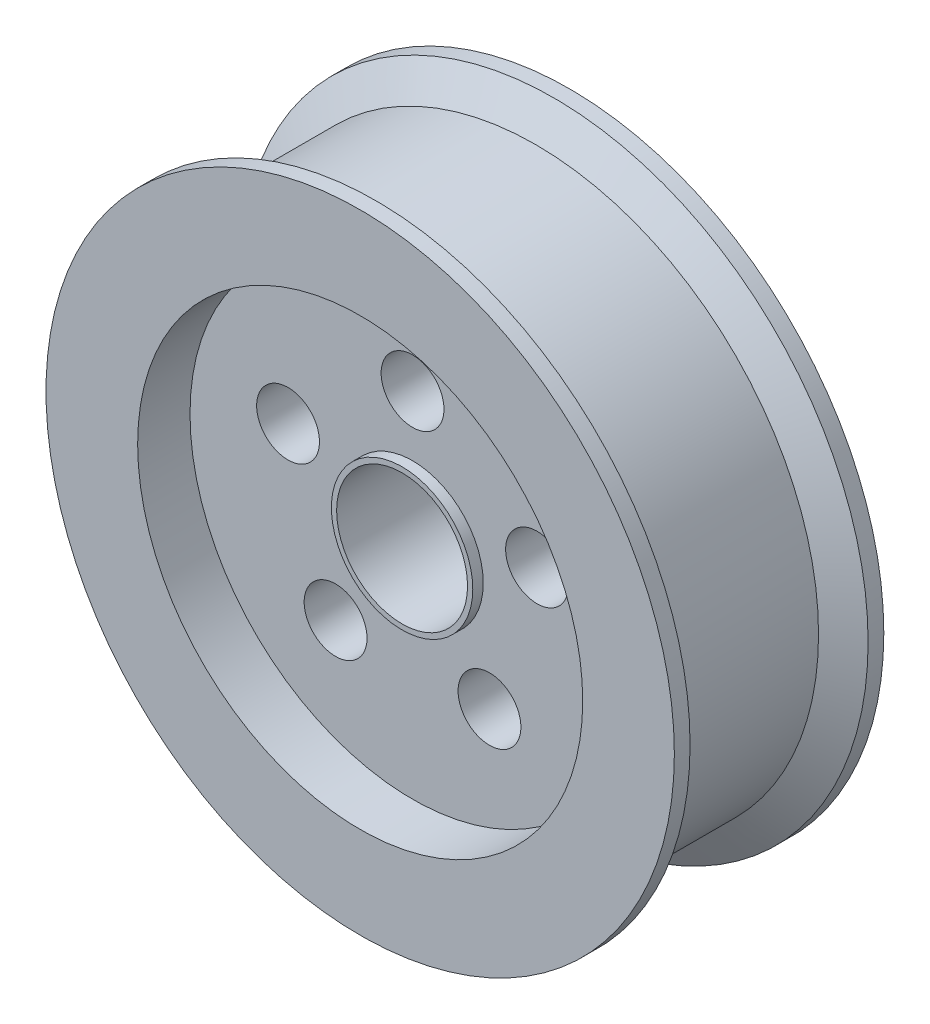
ISO-10303-21;
HEADER;
FILE_DESCRIPTION(('STEP AP214'),'2;1');
FILE_NAME('part.step','',(''),(''),'','','');
FILE_SCHEMA(('AUTOMOTIVE_DESIGN { 1 0 10303 214 1 1 1 1 }'));
ENDSEC;
DATA;
#1=APPLICATION_CONTEXT('core data for automotive mechanical design processes');
#2=APPLICATION_PROTOCOL_DEFINITION('international standard','automotive_design',2000,#1);
#3=PRODUCT_CONTEXT('',#1,'mechanical');
#4=PRODUCT('Part','Part','',(#3));
#5=PRODUCT_RELATED_PRODUCT_CATEGORY('part','',(#4));
#6=PRODUCT_DEFINITION_FORMATION('','',#4);
#7=PRODUCT_DEFINITION_CONTEXT('part definition',#1,'design');
#8=PRODUCT_DEFINITION('design','',#6,#7);
#9=PRODUCT_DEFINITION_SHAPE('','',#8);
#10=(LENGTH_UNIT() NAMED_UNIT(*) SI_UNIT(.MILLI.,.METRE.));
#11=(NAMED_UNIT(*) PLANE_ANGLE_UNIT() SI_UNIT($,.RADIAN.));
#12=(NAMED_UNIT(*) SI_UNIT($,.STERADIAN.) SOLID_ANGLE_UNIT());
#13=UNCERTAINTY_MEASURE_WITH_UNIT(LENGTH_MEASURE(1.E-05),#10,'distance_accuracy_value','');
#14=(GEOMETRIC_REPRESENTATION_CONTEXT(3) GLOBAL_UNCERTAINTY_ASSIGNED_CONTEXT((#13)) GLOBAL_UNIT_ASSIGNED_CONTEXT((#10,
#11,#12)) REPRESENTATION_CONTEXT('',''));
#15=CARTESIAN_POINT('',(0.,0.,0.));
#16=DIRECTION('',(0.,0.,1.));
#17=DIRECTION('',(1.,0.,0.));
#18=AXIS2_PLACEMENT_3D('',#15,#16,#17);
#19=CARTESIAN_POINT('',(0.,0.,20.));
#20=DIRECTION('',(0.,0.,-1.));
#21=DIRECTION('',(-1.,0.,0.));
#22=AXIS2_PLACEMENT_3D('',#19,#20,#21);
#23=CYLINDRICAL_SURFACE('',#22,60.);
#24=CARTESIAN_POINT('',(0.,0.,-17.));
#25=DIRECTION('',(0.,0.,1.));
#26=DIRECTION('',(1.,0.,0.));
#27=AXIS2_PLACEMENT_3D('',#24,#25,#26);
#28=CIRCLE('',#27,60.);
#29=CARTESIAN_POINT('',(60.,0.,-17.));
#30=VERTEX_POINT('',#29);
#31=EDGE_CURVE('E149',#30,#30,#28,.T.);
#32=ORIENTED_EDGE('',*,*,#31,.F.);
#33=EDGE_LOOP('',(#32));
#34=FACE_BOUND('',#33,.T.);
#35=CARTESIAN_POINT('',(0.,0.,-20.));
#36=DIRECTION('',(0.,0.,1.));
#37=DIRECTION('',(1.,0.,0.));
#38=AXIS2_PLACEMENT_3D('',#35,#36,#37);
#39=CIRCLE('',#38,60.);
#40=CARTESIAN_POINT('',(60.,0.,-20.));
#41=VERTEX_POINT('',#40);
#42=EDGE_CURVE('E57',#41,#41,#39,.T.);
#43=ORIENTED_EDGE('',*,*,#42,.T.);
#44=EDGE_LOOP('',(#43));
#45=FACE_BOUND('',#44,.T.);
#46=ADVANCED_FACE('F46',(#34,#45),#23,.T.);
#47=CARTESIAN_POINT('',(0.,0.,20.));
#48=DIRECTION('',(0.,0.,-1.));
#49=DIRECTION('',(-1.,0.,0.));
#50=AXIS2_PLACEMENT_3D('',#47,#48,#49);
#51=CYLINDRICAL_SURFACE('',#50,12.5);
#52=CARTESIAN_POINT('',(0.,0.,12.));
#53=DIRECTION('',(0.,0.,1.));
#54=DIRECTION('',(1.,0.,0.));
#55=AXIS2_PLACEMENT_3D('',#52,#53,#54);
#56=CIRCLE('',#55,12.5);
#57=CARTESIAN_POINT('',(12.5,0.,12.));
#58=VERTEX_POINT('',#57);
#59=EDGE_CURVE('E320',#58,#58,#56,.T.);
#60=ORIENTED_EDGE('',*,*,#59,.T.);
#61=EDGE_LOOP('',(#60));
#62=FACE_BOUND('',#61,.T.);
#63=CARTESIAN_POINT('',(0.,0.,-10.));
#64=DIRECTION('',(0.,0.,-1.));
#65=DIRECTION('',(-1.,0.,0.));
#66=AXIS2_PLACEMENT_3D('',#63,#64,#65);
#67=CIRCLE('',#66,12.5);
#68=CARTESIAN_POINT('',(-12.5,0.,-10.));
#69=VERTEX_POINT('',#68);
#70=EDGE_CURVE('E68',#69,#69,#67,.T.);
#71=ORIENTED_EDGE('',*,*,#70,.T.);
#72=EDGE_LOOP('',(#71));
#73=FACE_BOUND('',#72,.T.);
#74=ADVANCED_FACE('F121',(#62,#73),#51,.F.);
#75=CARTESIAN_POINT('',(0.,0.,20.));
#76=DIRECTION('',(0.,0.,1.));
#77=DIRECTION('',(1.,0.,0.));
#78=AXIS2_PLACEMENT_3D('',#75,#76,#77);
#79=PLANE('',#78);
#80=CARTESIAN_POINT('',(0.,0.,20.));
#81=DIRECTION('',(0.,0.,1.));
#82=DIRECTION('',(1.,0.,0.));
#83=AXIS2_PLACEMENT_3D('',#80,#81,#82);
#84=CIRCLE('',#83,42.5);
#85=CARTESIAN_POINT('',(42.5,0.,20.));
#86=VERTEX_POINT('',#85);
#87=EDGE_CURVE('E65',#86,#86,#84,.T.);
#88=ORIENTED_EDGE('',*,*,#87,.F.);
#89=EDGE_LOOP('',(#88));
#90=FACE_BOUND('',#89,.T.);
#91=CARTESIAN_POINT('',(0.,0.,20.));
#92=DIRECTION('',(0.,0.,1.));
#93=DIRECTION('',(1.,0.,0.));
#94=AXIS2_PLACEMENT_3D('',#91,#92,#93);
#95=CIRCLE('',#94,60.);
#96=CARTESIAN_POINT('',(60.,0.,20.));
#97=VERTEX_POINT('',#96);
#98=EDGE_CURVE('E53',#97,#97,#95,.T.);
#99=ORIENTED_EDGE('',*,*,#98,.T.);
#100=EDGE_LOOP('',(#99));
#101=FACE_BOUND('',#100,.T.);
#102=ADVANCED_FACE('F118',(#90,#101),#79,.T.);
#103=CARTESIAN_POINT('',(0.,0.,-20.));
#104=DIRECTION('',(0.,0.,1.));
#105=DIRECTION('',(1.,0.,0.));
#106=AXIS2_PLACEMENT_3D('',#103,#104,#105);
#107=PLANE('',#106);
#108=CARTESIAN_POINT('',(0.,0.,-20.));
#109=DIRECTION('',(0.,0.,1.));
#110=DIRECTION('',(1.,0.,0.));
#111=AXIS2_PLACEMENT_3D('',#108,#109,#110);
#112=CIRCLE('',#111,42.5);
#113=CARTESIAN_POINT('',(42.5,0.,-20.));
#114=VERTEX_POINT('',#113);
#115=EDGE_CURVE('E106',#114,#114,#112,.T.);
#116=ORIENTED_EDGE('',*,*,#115,.T.);
#117=EDGE_LOOP('',(#116));
#118=FACE_BOUND('',#117,.T.);
#119=ORIENTED_EDGE('',*,*,#42,.F.);
#120=EDGE_LOOP('',(#119));
#121=FACE_BOUND('',#120,.T.);
#122=ADVANCED_FACE('F120',(#118,#121),#107,.F.);
#123=CARTESIAN_POINT('',(0.,0.,17.));
#124=DIRECTION('',(0.,0.,1.));
#125=DIRECTION('',(1.,0.,0.));
#126=AXIS2_PLACEMENT_3D('',#123,#124,#125);
#127=CIRCLE('',#126,60.);
#128=CARTESIAN_POINT('',(60.,0.,17.));
#129=VERTEX_POINT('',#128);
#130=EDGE_CURVE('E147',#129,#129,#127,.T.);
#131=ORIENTED_EDGE('',*,*,#130,.T.);
#132=EDGE_LOOP('',(#131));
#133=FACE_BOUND('',#132,.T.);
#134=ORIENTED_EDGE('',*,*,#98,.F.);
#135=EDGE_LOOP('',(#134));
#136=FACE_BOUND('',#135,.T.);
#137=ADVANCED_FACE('F48',(#133,#136),#23,.T.);
#138=CARTESIAN_POINT('',(0.,0.,10.));
#139=DIRECTION('',(0.,0.,1.));
#140=DIRECTION('',(1.,0.,0.));
#141=AXIS2_PLACEMENT_3D('',#138,#139,#140);
#142=CYLINDRICAL_SURFACE('',#141,42.5);
#143=CARTESIAN_POINT('',(0.,0.,10.));
#144=DIRECTION('',(0.,0.,1.));
#145=DIRECTION('',(1.,0.,0.));
#146=AXIS2_PLACEMENT_3D('',#143,#144,#145);
#147=CIRCLE('',#146,42.5);
#148=CARTESIAN_POINT('',(42.5,0.,10.));
#149=VERTEX_POINT('',#148);
#150=EDGE_CURVE('E62',#149,#149,#147,.T.);
#151=ORIENTED_EDGE('',*,*,#150,.F.);
#152=EDGE_LOOP('',(#151));
#153=FACE_BOUND('',#152,.T.);
#154=ORIENTED_EDGE('',*,*,#87,.T.);
#155=EDGE_LOOP('',(#154));
#156=FACE_BOUND('',#155,.T.);
#157=ADVANCED_FACE('F116',(#153,#156),#142,.F.);
#158=CARTESIAN_POINT('',(0.,0.,10.));
#159=DIRECTION('',(0.,0.,1.));
#160=DIRECTION('',(1.,0.,0.));
#161=AXIS2_PLACEMENT_3D('',#158,#159,#160);
#162=PLANE('',#161);
#163=CARTESIAN_POINT('',(0.,0.,10.));
#164=DIRECTION('',(0.,0.,1.));
#165=DIRECTION('',(1.,0.,0.));
#166=AXIS2_PLACEMENT_3D('',#163,#164,#165);
#167=CIRCLE('',#166,13.5);
#168=CARTESIAN_POINT('',(13.5,0.,10.));
#169=VERTEX_POINT('',#168);
#170=EDGE_CURVE('E12',#169,#169,#167,.T.);
#171=ORIENTED_EDGE('',*,*,#170,.F.);
#172=EDGE_LOOP('',(#171));
#173=FACE_BOUND('',#172,.T.);
#174=CARTESIAN_POINT('',(14.6946313073117,-20.2254248593738,10.));
#175=DIRECTION('',(0.,0.,1.));
#176=DIRECTION('',(1.,0.,0.));
#177=AXIS2_PLACEMENT_3D('',#174,#175,#176);
#178=CIRCLE('',#177,6.);
#179=CARTESIAN_POINT('',(20.6946313073117,-20.2254248593738,10.));
#180=VERTEX_POINT('',#179);
#181=EDGE_CURVE('E80',#180,#180,#178,.T.);
#182=ORIENTED_EDGE('',*,*,#181,.F.);
#183=EDGE_LOOP('',(#182));
#184=FACE_BOUND('',#183,.T.);
#185=CARTESIAN_POINT('',(-14.694631307312,-20.2254248593736,10.));
#186=DIRECTION('',(0.,0.,1.));
#187=DIRECTION('',(1.,0.,0.));
#188=AXIS2_PLACEMENT_3D('',#185,#186,#187);
#189=CIRCLE('',#188,6.);
#190=CARTESIAN_POINT('',(-8.69463130731201,-20.2254248593736,10.));
#191=VERTEX_POINT('',#190);
#192=EDGE_CURVE('E88',#191,#191,#189,.T.);
#193=ORIENTED_EDGE('',*,*,#192,.F.);
#194=EDGE_LOOP('',(#193));
#195=FACE_BOUND('',#194,.T.);
#196=CARTESIAN_POINT('',(-23.7764129073788,7.72542485937396,10.));
#197=DIRECTION('',(0.,0.,1.));
#198=DIRECTION('',(1.,0.,0.));
#199=AXIS2_PLACEMENT_3D('',#196,#197,#198);
#200=CIRCLE('',#199,6.);
#201=CARTESIAN_POINT('',(-17.7764129073787,7.72542485937396,10.));
#202=VERTEX_POINT('',#201);
#203=EDGE_CURVE('E84',#202,#202,#200,.T.);
#204=ORIENTED_EDGE('',*,*,#203,.F.);
#205=EDGE_LOOP('',(#204));
#206=FACE_BOUND('',#205,.T.);
#207=CARTESIAN_POINT('',(23.7764129073789,7.72542485937362,10.));
#208=DIRECTION('',(0.,0.,1.));
#209=DIRECTION('',(1.,0.,0.));
#210=AXIS2_PLACEMENT_3D('',#207,#208,#209);
#211=CIRCLE('',#210,6.);
#212=CARTESIAN_POINT('',(29.7764129073789,7.72542485937362,10.));
#213=VERTEX_POINT('',#212);
#214=EDGE_CURVE('E76',#213,#213,#211,.T.);
#215=ORIENTED_EDGE('',*,*,#214,.F.);
#216=EDGE_LOOP('',(#215));
#217=FACE_BOUND('',#216,.T.);
#218=CARTESIAN_POINT('',(0.,25.,10.));
#219=DIRECTION('',(0.,0.,1.));
#220=DIRECTION('',(1.,0.,0.));
#221=AXIS2_PLACEMENT_3D('',#218,#219,#220);
#222=CIRCLE('',#221,6.);
#223=CARTESIAN_POINT('',(6.,25.,10.));
#224=VERTEX_POINT('',#223);
#225=EDGE_CURVE('E75',#224,#224,#222,.T.);
#226=ORIENTED_EDGE('',*,*,#225,.F.);
#227=EDGE_LOOP('',(#226));
#228=FACE_BOUND('',#227,.T.);
#229=ORIENTED_EDGE('',*,*,#150,.T.);
#230=EDGE_LOOP('',(#229));
#231=FACE_BOUND('',#230,.T.);
#232=ADVANCED_FACE('F141',(#173,#184,#195,#206,#217,#228,#231),#162,.T.);
#233=CARTESIAN_POINT('',(0.,0.,-10.));
#234=DIRECTION('',(0.,0.,-1.));
#235=DIRECTION('',(-1.,0.,0.));
#236=AXIS2_PLACEMENT_3D('',#233,#234,#235);
#237=CYLINDRICAL_SURFACE('',#236,42.5);
#238=CARTESIAN_POINT('',(0.,0.,-10.));
#239=DIRECTION('',(0.,0.,1.));
#240=DIRECTION('',(1.,0.,0.));
#241=AXIS2_PLACEMENT_3D('',#238,#239,#240);
#242=CIRCLE('',#241,42.5);
#243=CARTESIAN_POINT('',(42.5,0.,-10.));
#244=VERTEX_POINT('',#243);
#245=EDGE_CURVE('E71',#244,#244,#242,.T.);
#246=ORIENTED_EDGE('',*,*,#245,.T.);
#247=EDGE_LOOP('',(#246));
#248=FACE_BOUND('',#247,.T.);
#249=ORIENTED_EDGE('',*,*,#115,.F.);
#250=EDGE_LOOP('',(#249));
#251=FACE_BOUND('',#250,.T.);
#252=ADVANCED_FACE('F200',(#248,#251),#237,.F.);
#253=CARTESIAN_POINT('',(0.,0.,-10.));
#254=DIRECTION('',(0.,0.,-1.));
#255=DIRECTION('',(1.,0.,0.));
#256=AXIS2_PLACEMENT_3D('',#253,#254,#255);
#257=PLANE('',#256);
#258=CARTESIAN_POINT('',(14.6946313073117,-20.2254248593738,-10.));
#259=DIRECTION('',(0.,0.,-1.));
#260=DIRECTION('',(-1.,0.,0.));
#261=AXIS2_PLACEMENT_3D('',#258,#259,#260);
#262=CIRCLE('',#261,6.);
#263=CARTESIAN_POINT('',(8.69463130731171,-20.2254248593738,-10.));
#264=VERTEX_POINT('',#263);
#265=EDGE_CURVE('E89',#264,#264,#262,.T.);
#266=ORIENTED_EDGE('',*,*,#265,.F.);
#267=EDGE_LOOP('',(#266));
#268=FACE_BOUND('',#267,.T.);
#269=CARTESIAN_POINT('',(-14.694631307312,-20.2254248593736,-10.));
#270=DIRECTION('',(0.,0.,-1.));
#271=DIRECTION('',(-1.,0.,0.));
#272=AXIS2_PLACEMENT_3D('',#269,#270,#271);
#273=CIRCLE('',#272,6.);
#274=CARTESIAN_POINT('',(-20.694631307312,-20.2254248593736,-10.));
#275=VERTEX_POINT('',#274);
#276=EDGE_CURVE('E86',#275,#275,#273,.T.);
#277=ORIENTED_EDGE('',*,*,#276,.F.);
#278=EDGE_LOOP('',(#277));
#279=FACE_BOUND('',#278,.T.);
#280=CARTESIAN_POINT('',(-23.7764129073788,7.72542485937396,-10.));
#281=DIRECTION('',(0.,0.,-1.));
#282=DIRECTION('',(-1.,0.,0.));
#283=AXIS2_PLACEMENT_3D('',#280,#281,#282);
#284=CIRCLE('',#283,6.);
#285=CARTESIAN_POINT('',(-29.7764129073788,7.72542485937396,-10.));
#286=VERTEX_POINT('',#285);
#287=EDGE_CURVE('E81',#286,#286,#284,.T.);
#288=ORIENTED_EDGE('',*,*,#287,.F.);
#289=EDGE_LOOP('',(#288));
#290=FACE_BOUND('',#289,.T.);
#291=CARTESIAN_POINT('',(23.7764129073789,7.72542485937362,-10.));
#292=DIRECTION('',(0.,0.,-1.));
#293=DIRECTION('',(-1.,0.,0.));
#294=AXIS2_PLACEMENT_3D('',#291,#292,#293);
#295=CIRCLE('',#294,6.);
#296=CARTESIAN_POINT('',(17.7764129073789,7.72542485937362,-10.));
#297=VERTEX_POINT('',#296);
#298=EDGE_CURVE('E77',#297,#297,#295,.T.);
#299=ORIENTED_EDGE('',*,*,#298,.F.);
#300=EDGE_LOOP('',(#299));
#301=FACE_BOUND('',#300,.T.);
#302=CARTESIAN_POINT('',(0.,25.,-10.));
#303=DIRECTION('',(0.,0.,-1.));
#304=DIRECTION('',(-1.,0.,0.));
#305=AXIS2_PLACEMENT_3D('',#302,#303,#304);
#306=CIRCLE('',#305,6.);
#307=CARTESIAN_POINT('',(-6.,25.,-10.));
#308=VERTEX_POINT('',#307);
#309=EDGE_CURVE('E72',#308,#308,#306,.T.);
#310=ORIENTED_EDGE('',*,*,#309,.F.);
#311=EDGE_LOOP('',(#310));
#312=FACE_BOUND('',#311,.T.);
#313=ORIENTED_EDGE('',*,*,#70,.F.);
#314=EDGE_LOOP('',(#313));
#315=FACE_BOUND('',#314,.T.);
#316=ORIENTED_EDGE('',*,*,#245,.F.);
#317=EDGE_LOOP('',(#316));
#318=FACE_BOUND('',#317,.T.);
#319=ADVANCED_FACE('F196',(#268,#279,#290,#301,#312,#315,#318),#257,.T.);
#320=CARTESIAN_POINT('',(0.,25.,-20.));
#321=DIRECTION('',(0.,0.,1.));
#322=DIRECTION('',(1.,0.,0.));
#323=AXIS2_PLACEMENT_3D('',#320,#321,#322);
#324=CYLINDRICAL_SURFACE('',#323,6.);
#325=ORIENTED_EDGE('',*,*,#225,.T.);
#326=EDGE_LOOP('',(#325));
#327=FACE_BOUND('',#326,.T.);
#328=ORIENTED_EDGE('',*,*,#309,.T.);
#329=EDGE_LOOP('',(#328));
#330=FACE_BOUND('',#329,.T.);
#331=ADVANCED_FACE('F192',(#327,#330),#324,.F.);
#332=CARTESIAN_POINT('',(23.7764129073789,7.72542485937362,-20.));
#333=DIRECTION('',(0.,0.,1.));
#334=DIRECTION('',(1.,0.,0.));
#335=AXIS2_PLACEMENT_3D('',#332,#333,#334);
#336=CYLINDRICAL_SURFACE('',#335,6.);
#337=ORIENTED_EDGE('',*,*,#214,.T.);
#338=EDGE_LOOP('',(#337));
#339=FACE_BOUND('',#338,.T.);
#340=ORIENTED_EDGE('',*,*,#298,.T.);
#341=EDGE_LOOP('',(#340));
#342=FACE_BOUND('',#341,.T.);
#343=ADVANCED_FACE('F188',(#339,#342),#336,.F.);
#344=CARTESIAN_POINT('',(-23.7764129073788,7.72542485937396,-20.));
#345=DIRECTION('',(0.,0.,1.));
#346=DIRECTION('',(1.,0.,0.));
#347=AXIS2_PLACEMENT_3D('',#344,#345,#346);
#348=CYLINDRICAL_SURFACE('',#347,6.);
#349=ORIENTED_EDGE('',*,*,#203,.T.);
#350=EDGE_LOOP('',(#349));
#351=FACE_BOUND('',#350,.T.);
#352=ORIENTED_EDGE('',*,*,#287,.T.);
#353=EDGE_LOOP('',(#352));
#354=FACE_BOUND('',#353,.T.);
#355=ADVANCED_FACE('F185',(#351,#354),#348,.F.);
#356=CARTESIAN_POINT('',(-14.694631307312,-20.2254248593736,-20.));
#357=DIRECTION('',(0.,0.,1.));
#358=DIRECTION('',(1.,0.,0.));
#359=AXIS2_PLACEMENT_3D('',#356,#357,#358);
#360=CYLINDRICAL_SURFACE('',#359,6.);
#361=ORIENTED_EDGE('',*,*,#192,.T.);
#362=EDGE_LOOP('',(#361));
#363=FACE_BOUND('',#362,.T.);
#364=ORIENTED_EDGE('',*,*,#276,.T.);
#365=EDGE_LOOP('',(#364));
#366=FACE_BOUND('',#365,.T.);
#367=ADVANCED_FACE('F181',(#363,#366),#360,.F.);
#368=CARTESIAN_POINT('',(14.6946313073117,-20.2254248593738,-20.));
#369=DIRECTION('',(0.,0.,1.));
#370=DIRECTION('',(1.,0.,0.));
#371=AXIS2_PLACEMENT_3D('',#368,#369,#370);
#372=CYLINDRICAL_SURFACE('',#371,6.);
#373=ORIENTED_EDGE('',*,*,#181,.T.);
#374=EDGE_LOOP('',(#373));
#375=FACE_BOUND('',#374,.T.);
#376=ORIENTED_EDGE('',*,*,#265,.T.);
#377=EDGE_LOOP('',(#376));
#378=FACE_BOUND('',#377,.T.);
#379=ADVANCED_FACE('F174',(#375,#378),#372,.F.);
#380=CARTESIAN_POINT('',(0.,0.,0.));
#381=DIRECTION('',(0.,0.,1.));
#382=DIRECTION('',(1.,0.,0.));
#383=AXIS2_PLACEMENT_3D('',#380,#381,#382);
#384=CYLINDRICAL_SURFACE('',#383,54.);
#385=CARTESIAN_POINT('',(0.,0.,13.5358983848622));
#386=DIRECTION('',(0.,0.,1.));
#387=DIRECTION('',(1.,0.,0.));
#388=AXIS2_PLACEMENT_3D('',#385,#386,#387);
#389=CIRCLE('',#388,54.);
#390=CARTESIAN_POINT('',(54.,0.,13.5358983848622));
#391=VERTEX_POINT('',#390);
#392=EDGE_CURVE('E150',#391,#391,#389,.T.);
#393=ORIENTED_EDGE('',*,*,#392,.F.);
#394=EDGE_LOOP('',(#393));
#395=FACE_BOUND('',#394,.T.);
#396=CARTESIAN_POINT('',(0.,0.,-13.5358983848622));
#397=DIRECTION('',(0.,0.,1.));
#398=DIRECTION('',(1.,0.,0.));
#399=AXIS2_PLACEMENT_3D('',#396,#397,#398);
#400=CIRCLE('',#399,54.);
#401=CARTESIAN_POINT('',(54.,0.,-13.5358983848622));
#402=VERTEX_POINT('',#401);
#403=EDGE_CURVE('E85',#402,#402,#400,.T.);
#404=ORIENTED_EDGE('',*,*,#403,.T.);
#405=EDGE_LOOP('',(#404));
#406=FACE_BOUND('',#405,.T.);
#407=ADVANCED_FACE('F161',(#395,#406),#384,.T.);
#408=CARTESIAN_POINT('',(0.,0.,-17.));
#409=DIRECTION('',(0.,0.,-1.));
#410=DIRECTION('',(-1.,0.,0.));
#411=AXIS2_PLACEMENT_3D('',#408,#409,#410);
#412=CONICAL_SURFACE('',#411,60.,1.04719755119659);
#413=ORIENTED_EDGE('',*,*,#403,.F.);
#414=EDGE_LOOP('',(#413));
#415=FACE_BOUND('',#414,.T.);
#416=ORIENTED_EDGE('',*,*,#31,.T.);
#417=EDGE_LOOP('',(#416));
#418=FACE_BOUND('',#417,.T.);
#419=ADVANCED_FACE('F163',(#415,#418),#412,.T.);
#420=CARTESIAN_POINT('',(0.,0.,13.5358983848622));
#421=DIRECTION('',(0.,0.,1.));
#422=DIRECTION('',(1.,0.,0.));
#423=AXIS2_PLACEMENT_3D('',#420,#421,#422);
#424=CONICAL_SURFACE('',#423,54.,1.04719755119659);
#425=ORIENTED_EDGE('',*,*,#130,.F.);
#426=EDGE_LOOP('',(#425));
#427=FACE_BOUND('',#426,.T.);
#428=ORIENTED_EDGE('',*,*,#392,.T.);
#429=EDGE_LOOP('',(#428));
#430=FACE_BOUND('',#429,.T.);
#431=ADVANCED_FACE('F166',(#427,#430),#424,.T.);
#432=CARTESIAN_POINT('',(0.,0.,3.));
#433=DIRECTION('',(0.,0.,1.));
#434=DIRECTION('',(1.,0.,0.));
#435=AXIS2_PLACEMENT_3D('',#432,#433,#434);
#436=CYLINDRICAL_SURFACE('',#435,13.5);
#437=ORIENTED_EDGE('',*,*,#170,.T.);
#438=EDGE_LOOP('',(#437));
#439=FACE_BOUND('',#438,.T.);
#440=CARTESIAN_POINT('',(0.,0.,12.));
#441=DIRECTION('',(0.,0.,1.));
#442=DIRECTION('',(1.,0.,0.));
#443=AXIS2_PLACEMENT_3D('',#440,#441,#442);
#444=CIRCLE('',#443,13.5);
#445=CARTESIAN_POINT('',(13.5,0.,12.));
#446=VERTEX_POINT('',#445);
#447=EDGE_CURVE('E155',#446,#446,#444,.T.);
#448=ORIENTED_EDGE('',*,*,#447,.F.);
#449=EDGE_LOOP('',(#448));
#450=FACE_BOUND('',#449,.T.);
#451=ADVANCED_FACE('F172',(#439,#450),#436,.T.);
#452=CARTESIAN_POINT('',(0.,0.,12.));
#453=DIRECTION('',(0.,0.,1.));
#454=DIRECTION('',(1.,0.,0.));
#455=AXIS2_PLACEMENT_3D('',#452,#453,#454);
#456=PLANE('',#455);
#457=ORIENTED_EDGE('',*,*,#447,.T.);
#458=EDGE_LOOP('',(#457));
#459=FACE_BOUND('',#458,.T.);
#460=ORIENTED_EDGE('',*,*,#59,.F.);
#461=EDGE_LOOP('',(#460));
#462=FACE_BOUND('',#461,.T.);
#463=ADVANCED_FACE('F304',(#459,#462),#456,.T.);
#464=CLOSED_SHELL('',(#46,#74,#102,#122,#137,#157,#232,#252,#319,#331,#343,#355,#367,#379,#407,
#419,#431,#451,#463));
#465=MANIFOLD_SOLID_BREP('B2',#464);
#466=ADVANCED_BREP_SHAPE_REPRESENTATION('',(#18,#465),#14);
#467=SHAPE_DEFINITION_REPRESENTATION(#9,#466);
ENDSEC;
END-ISO-10303-21;
